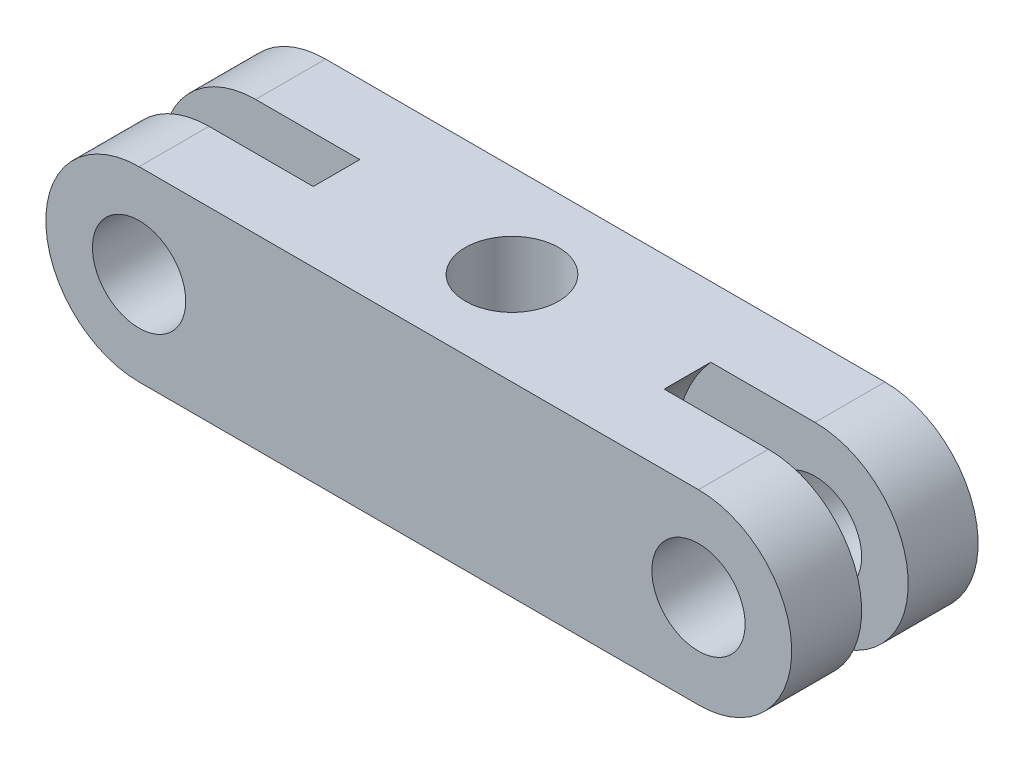
ISO-10303-21;
HEADER;
FILE_DESCRIPTION(('STEP AP214'),'2;1');
FILE_NAME('part.step','',(''),(''),'','','');
FILE_SCHEMA(('AUTOMOTIVE_DESIGN { 1 0 10303 214 1 1 1 1 }'));
ENDSEC;
DATA;
#1=APPLICATION_CONTEXT('core data for automotive mechanical design processes');
#2=APPLICATION_PROTOCOL_DEFINITION('international standard','automotive_design',2000,#1);
#3=PRODUCT_CONTEXT('',#1,'mechanical');
#4=PRODUCT('Part','Part','',(#3));
#5=PRODUCT_RELATED_PRODUCT_CATEGORY('part','',(#4));
#6=PRODUCT_DEFINITION_FORMATION('','',#4);
#7=PRODUCT_DEFINITION_CONTEXT('part definition',#1,'design');
#8=PRODUCT_DEFINITION('design','',#6,#7);
#9=PRODUCT_DEFINITION_SHAPE('','',#8);
#10=(LENGTH_UNIT() NAMED_UNIT(*) SI_UNIT(.MILLI.,.METRE.));
#11=(NAMED_UNIT(*) PLANE_ANGLE_UNIT() SI_UNIT($,.RADIAN.));
#12=(NAMED_UNIT(*) SI_UNIT($,.STERADIAN.) SOLID_ANGLE_UNIT());
#13=UNCERTAINTY_MEASURE_WITH_UNIT(LENGTH_MEASURE(1.E-05),#10,'distance_accuracy_value','');
#14=(GEOMETRIC_REPRESENTATION_CONTEXT(3) GLOBAL_UNCERTAINTY_ASSIGNED_CONTEXT((#13)) GLOBAL_UNIT_ASSIGNED_CONTEXT((#10,
#11,#12)) REPRESENTATION_CONTEXT('',''));
#15=CARTESIAN_POINT('',(0.,0.,0.));
#16=DIRECTION('',(0.,0.,1.));
#17=DIRECTION('',(1.,0.,0.));
#18=AXIS2_PLACEMENT_3D('',#15,#16,#17);
#19=CARTESIAN_POINT('',(0.,0.,10.));
#20=DIRECTION('',(0.,0.,-1.));
#21=DIRECTION('',(-1.,0.,0.));
#22=AXIS2_PLACEMENT_3D('',#19,#20,#21);
#23=CYLINDRICAL_SURFACE('',#22,10.);
#24=CARTESIAN_POINT('',(0.,0.,-2.5));
#25=DIRECTION('',(0.,0.,1.));
#26=DIRECTION('',(1.,0.,0.));
#27=AXIS2_PLACEMENT_3D('',#24,#25,#26);
#28=CIRCLE('',#27,10.);
#29=CARTESIAN_POINT('',(0.,10.,-2.5));
#30=VERTEX_POINT('',#29);
#31=CARTESIAN_POINT('',(0.,-10.,-2.5));
#32=VERTEX_POINT('',#31);
#33=EDGE_CURVE('E160',#30,#32,#28,.T.);
#34=ORIENTED_EDGE('',*,*,#33,.F.);
#35=DIRECTION('',(0.,0.,-1.));
#36=VECTOR('',#35,1.);
#37=CARTESIAN_POINT('',(0.,10.,10.));
#38=LINE('',#37,#36);
#39=CARTESIAN_POINT('',(0.,10.,-10.));
#40=VERTEX_POINT('',#39);
#41=EDGE_CURVE('E181',#30,#40,#38,.T.);
#42=ORIENTED_EDGE('',*,*,#41,.T.);
#43=CARTESIAN_POINT('',(0.,0.,-10.));
#44=DIRECTION('',(0.,0.,1.));
#45=DIRECTION('',(1.,0.,0.));
#46=AXIS2_PLACEMENT_3D('',#43,#44,#45);
#47=CIRCLE('',#46,10.);
#48=CARTESIAN_POINT('',(0.,-10.,-10.));
#49=VERTEX_POINT('',#48);
#50=EDGE_CURVE('E168',#40,#49,#47,.T.);
#51=ORIENTED_EDGE('',*,*,#50,.T.);
#52=DIRECTION('',(0.,0.,-1.));
#53=VECTOR('',#52,1.);
#54=CARTESIAN_POINT('',(0.,-10.,10.));
#55=LINE('',#54,#53);
#56=EDGE_CURVE('E204',#32,#49,#55,.T.);
#57=ORIENTED_EDGE('',*,*,#56,.F.);
#58=EDGE_LOOP('',(#34,#42,#51,#57));
#59=FACE_BOUND('',#58,.T.);
#60=ADVANCED_FACE('F39',(#59),#23,.T.);
#61=CARTESIAN_POINT('',(0.,-10.,10.));
#62=DIRECTION('',(0.,1.,0.));
#63=DIRECTION('',(0.,0.,1.));
#64=AXIS2_PLACEMENT_3D('',#61,#62,#63);
#65=PLANE('',#64);
#66=CARTESIAN_POINT('',(30.,-10.,0.));
#67=DIRECTION('',(0.,1.,0.));
#68=DIRECTION('',(0.,0.,1.));
#69=AXIS2_PLACEMENT_3D('',#66,#67,#68);
#70=CIRCLE('',#69,5.);
#71=CARTESIAN_POINT('',(30.,-10.,5.));
#72=VERTEX_POINT('',#71);
#73=EDGE_CURVE('E263',#72,#72,#70,.T.);
#74=ORIENTED_EDGE('',*,*,#73,.T.);
#75=EDGE_LOOP('',(#74));
#76=FACE_BOUND('',#75,.T.);
#77=DIRECTION('',(1.,0.,0.));
#78=VECTOR('',#77,1.);
#79=CARTESIAN_POINT('',(0.,-10.,-2.5));
#80=LINE('',#79,#78);
#81=CARTESIAN_POINT('',(11.180339887499,-10.,-2.5));
#82=VERTEX_POINT('',#81);
#83=EDGE_CURVE('E155',#32,#82,#80,.T.);
#84=ORIENTED_EDGE('',*,*,#83,.F.);
#85=ORIENTED_EDGE('',*,*,#56,.T.);
#86=DIRECTION('',(1.,0.,0.));
#87=VECTOR('',#86,1.);
#88=CARTESIAN_POINT('',(0.,-10.,-10.));
#89=LINE('',#88,#87);
#90=CARTESIAN_POINT('',(60.,-10.,-10.));
#91=VERTEX_POINT('',#90);
#92=EDGE_CURVE('E189',#49,#91,#89,.T.);
#93=ORIENTED_EDGE('',*,*,#92,.T.);
#94=DIRECTION('',(0.,0.,-1.));
#95=VECTOR('',#94,1.);
#96=CARTESIAN_POINT('',(60.,-10.,10.));
#97=LINE('',#96,#95);
#98=CARTESIAN_POINT('',(60.,-10.,-2.5));
#99=VERTEX_POINT('',#98);
#100=EDGE_CURVE('E203',#99,#91,#97,.T.);
#101=ORIENTED_EDGE('',*,*,#100,.F.);
#102=DIRECTION('',(1.,0.,0.));
#103=VECTOR('',#102,1.);
#104=CARTESIAN_POINT('',(0.,-10.,-2.5));
#105=LINE('',#104,#103);
#106=CARTESIAN_POINT('',(48.8196601125011,-10.,-2.5));
#107=VERTEX_POINT('',#106);
#108=EDGE_CURVE('E147',#107,#99,#105,.T.);
#109=ORIENTED_EDGE('',*,*,#108,.F.);
#110=DIRECTION('',(0.,0.,1.));
#111=VECTOR('',#110,1.);
#112=CARTESIAN_POINT('',(48.8196601125011,-10.,-2.5));
#113=LINE('',#112,#111);
#114=CARTESIAN_POINT('',(48.8196601125011,-10.,2.5));
#115=VERTEX_POINT('',#114);
#116=EDGE_CURVE('E137',#107,#115,#113,.T.);
#117=ORIENTED_EDGE('',*,*,#116,.T.);
#118=DIRECTION('',(1.,0.,0.));
#119=VECTOR('',#118,1.);
#120=CARTESIAN_POINT('',(0.,-10.,2.5));
#121=LINE('',#120,#119);
#122=CARTESIAN_POINT('',(60.,-10.,2.5));
#123=VERTEX_POINT('',#122);
#124=EDGE_CURVE('E127',#115,#123,#121,.T.);
#125=ORIENTED_EDGE('',*,*,#124,.T.);
#126=CARTESIAN_POINT('',(60.,-10.,10.));
#127=VERTEX_POINT('',#126);
#128=EDGE_CURVE('E205',#127,#123,#97,.T.);
#129=ORIENTED_EDGE('',*,*,#128,.F.);
#130=DIRECTION('',(1.,0.,0.));
#131=VECTOR('',#130,1.);
#132=CARTESIAN_POINT('',(0.,-10.,10.));
#133=LINE('',#132,#131);
#134=CARTESIAN_POINT('',(0.,-10.,10.));
#135=VERTEX_POINT('',#134);
#136=EDGE_CURVE('E178',#135,#127,#133,.T.);
#137=ORIENTED_EDGE('',*,*,#136,.F.);
#138=CARTESIAN_POINT('',(0.,-10.,2.5));
#139=VERTEX_POINT('',#138);
#140=EDGE_CURVE('E202',#135,#139,#55,.T.);
#141=ORIENTED_EDGE('',*,*,#140,.T.);
#142=DIRECTION('',(1.,0.,0.));
#143=VECTOR('',#142,1.);
#144=CARTESIAN_POINT('',(0.,-10.,2.5));
#145=LINE('',#144,#143);
#146=CARTESIAN_POINT('',(11.180339887499,-10.,2.5));
#147=VERTEX_POINT('',#146);
#148=EDGE_CURVE('E224',#139,#147,#145,.T.);
#149=ORIENTED_EDGE('',*,*,#148,.T.);
#150=DIRECTION('',(0.,0.,1.));
#151=VECTOR('',#150,1.);
#152=CARTESIAN_POINT('',(11.180339887499,-10.,-2.5));
#153=LINE('',#152,#151);
#154=EDGE_CURVE('E151',#147,#82,#153,.F.);
#155=ORIENTED_EDGE('',*,*,#154,.T.);
#156=EDGE_LOOP('',(#84,#85,#93,#101,#109,#117,#125,#129,#137,#141,#149,#155));
#157=FACE_BOUND('',#156,.T.);
#158=ADVANCED_FACE('F146',(#76,#157),#65,.F.);
#159=CARTESIAN_POINT('',(60.,0.,10.));
#160=DIRECTION('',(0.,0.,-1.));
#161=DIRECTION('',(-1.,0.,0.));
#162=AXIS2_PLACEMENT_3D('',#159,#160,#161);
#163=CYLINDRICAL_SURFACE('',#162,10.);
#164=CARTESIAN_POINT('',(60.,0.,-2.5));
#165=DIRECTION('',(0.,0.,1.));
#166=DIRECTION('',(1.,0.,0.));
#167=AXIS2_PLACEMENT_3D('',#164,#165,#166);
#168=CIRCLE('',#167,10.);
#169=CARTESIAN_POINT('',(60.,10.,-2.5));
#170=VERTEX_POINT('',#169);
#171=EDGE_CURVE('E237',#99,#170,#168,.T.);
#172=ORIENTED_EDGE('',*,*,#171,.F.);
#173=ORIENTED_EDGE('',*,*,#100,.T.);
#174=CARTESIAN_POINT('',(60.,0.,-10.));
#175=DIRECTION('',(0.,0.,1.));
#176=DIRECTION('',(1.,0.,0.));
#177=AXIS2_PLACEMENT_3D('',#174,#175,#176);
#178=CIRCLE('',#177,10.);
#179=CARTESIAN_POINT('',(60.,10.,-10.));
#180=VERTEX_POINT('',#179);
#181=EDGE_CURVE('E188',#91,#180,#178,.T.);
#182=ORIENTED_EDGE('',*,*,#181,.T.);
#183=DIRECTION('',(0.,0.,-1.));
#184=VECTOR('',#183,1.);
#185=CARTESIAN_POINT('',(60.,10.,10.));
#186=LINE('',#185,#184);
#187=EDGE_CURVE('E197',#170,#180,#186,.T.);
#188=ORIENTED_EDGE('',*,*,#187,.F.);
#189=EDGE_LOOP('',(#172,#173,#182,#188));
#190=FACE_BOUND('',#189,.T.);
#191=ADVANCED_FACE('F257',(#190),#163,.T.);
#192=CARTESIAN_POINT('',(0.,10.,10.));
#193=DIRECTION('',(0.,-1.,0.));
#194=DIRECTION('',(0.,0.,-1.));
#195=AXIS2_PLACEMENT_3D('',#192,#193,#194);
#196=PLANE('',#195);
#197=CARTESIAN_POINT('',(30.,10.,0.));
#198=DIRECTION('',(0.,1.,0.));
#199=DIRECTION('',(0.,0.,1.));
#200=AXIS2_PLACEMENT_3D('',#197,#198,#199);
#201=CIRCLE('',#200,5.);
#202=CARTESIAN_POINT('',(30.,10.,5.));
#203=VERTEX_POINT('',#202);
#204=EDGE_CURVE('E264',#203,#203,#201,.T.);
#205=ORIENTED_EDGE('',*,*,#204,.F.);
#206=EDGE_LOOP('',(#205));
#207=FACE_BOUND('',#206,.T.);
#208=DIRECTION('',(-1.,0.,0.));
#209=VECTOR('',#208,1.);
#210=CARTESIAN_POINT('',(0.,10.,-2.5));
#211=LINE('',#210,#209);
#212=CARTESIAN_POINT('',(11.180339887499,10.,-2.5));
#213=VERTEX_POINT('',#212);
#214=EDGE_CURVE('E225',#213,#30,#211,.T.);
#215=ORIENTED_EDGE('',*,*,#214,.F.);
#216=DIRECTION('',(0.,0.,1.));
#217=VECTOR('',#216,1.);
#218=CARTESIAN_POINT('',(11.180339887499,10.,-2.5));
#219=LINE('',#218,#217);
#220=CARTESIAN_POINT('',(11.180339887499,10.,2.5));
#221=VERTEX_POINT('',#220);
#222=EDGE_CURVE('E11',#213,#221,#219,.T.);
#223=ORIENTED_EDGE('',*,*,#222,.T.);
#224=DIRECTION('',(-1.,0.,0.));
#225=VECTOR('',#224,1.);
#226=CARTESIAN_POINT('',(0.,10.,2.5));
#227=LINE('',#226,#225);
#228=CARTESIAN_POINT('',(0.,10.,2.5));
#229=VERTEX_POINT('',#228);
#230=EDGE_CURVE('E218',#221,#229,#227,.T.);
#231=ORIENTED_EDGE('',*,*,#230,.T.);
#232=CARTESIAN_POINT('',(0.,10.,10.));
#233=VERTEX_POINT('',#232);
#234=EDGE_CURVE('E192',#233,#229,#38,.T.);
#235=ORIENTED_EDGE('',*,*,#234,.F.);
#236=DIRECTION('',(-1.,0.,0.));
#237=VECTOR('',#236,1.);
#238=CARTESIAN_POINT('',(0.,10.,10.));
#239=LINE('',#238,#237);
#240=CARTESIAN_POINT('',(60.,10.,10.));
#241=VERTEX_POINT('',#240);
#242=EDGE_CURVE('E182',#241,#233,#239,.T.);
#243=ORIENTED_EDGE('',*,*,#242,.F.);
#244=CARTESIAN_POINT('',(60.,10.,2.5));
#245=VERTEX_POINT('',#244);
#246=EDGE_CURVE('E196',#241,#245,#186,.T.);
#247=ORIENTED_EDGE('',*,*,#246,.T.);
#248=DIRECTION('',(-1.,0.,0.));
#249=VECTOR('',#248,1.);
#250=CARTESIAN_POINT('',(0.,10.,2.5));
#251=LINE('',#250,#249);
#252=CARTESIAN_POINT('',(48.8196601125011,10.,2.5));
#253=VERTEX_POINT('',#252);
#254=EDGE_CURVE('E211',#245,#253,#251,.T.);
#255=ORIENTED_EDGE('',*,*,#254,.T.);
#256=DIRECTION('',(0.,0.,1.));
#257=VECTOR('',#256,1.);
#258=CARTESIAN_POINT('',(48.8196601125011,10.,-2.5));
#259=LINE('',#258,#257);
#260=CARTESIAN_POINT('',(48.8196601125011,10.,-2.5));
#261=VERTEX_POINT('',#260);
#262=EDGE_CURVE('E50',#253,#261,#259,.F.);
#263=ORIENTED_EDGE('',*,*,#262,.T.);
#264=DIRECTION('',(-1.,0.,0.));
#265=VECTOR('',#264,1.);
#266=CARTESIAN_POINT('',(0.,10.,-2.5));
#267=LINE('',#266,#265);
#268=EDGE_CURVE('E214',#170,#261,#267,.T.);
#269=ORIENTED_EDGE('',*,*,#268,.F.);
#270=ORIENTED_EDGE('',*,*,#187,.T.);
#271=DIRECTION('',(-1.,0.,0.));
#272=VECTOR('',#271,1.);
#273=CARTESIAN_POINT('',(0.,10.,-10.));
#274=LINE('',#273,#272);
#275=EDGE_CURVE('E180',#180,#40,#274,.T.);
#276=ORIENTED_EDGE('',*,*,#275,.T.);
#277=ORIENTED_EDGE('',*,*,#41,.F.);
#278=EDGE_LOOP('',(#215,#223,#231,#235,#243,#247,#255,#263,#269,#270,#276,#277));
#279=FACE_BOUND('',#278,.T.);
#280=ADVANCED_FACE('F226',(#207,#279),#196,.F.);
#281=CARTESIAN_POINT('',(0.,0.,10.));
#282=DIRECTION('',(0.,0.,-1.));
#283=DIRECTION('',(-1.,0.,0.));
#284=AXIS2_PLACEMENT_3D('',#281,#282,#283);
#285=CYLINDRICAL_SURFACE('',#284,5.);
#286=CARTESIAN_POINT('',(0.,0.,-10.));
#287=DIRECTION('',(0.,0.,1.));
#288=DIRECTION('',(1.,0.,0.));
#289=AXIS2_PLACEMENT_3D('',#286,#287,#288);
#290=CIRCLE('',#289,5.);
#291=CARTESIAN_POINT('',(5.,0.,-10.));
#292=VERTEX_POINT('',#291);
#293=EDGE_CURVE('E163',#292,#292,#290,.T.);
#294=ORIENTED_EDGE('',*,*,#293,.F.);
#295=EDGE_LOOP('',(#294));
#296=FACE_BOUND('',#295,.T.);
#297=CARTESIAN_POINT('',(0.,0.,-2.5));
#298=DIRECTION('',(0.,0.,1.));
#299=DIRECTION('',(1.,0.,0.));
#300=AXIS2_PLACEMENT_3D('',#297,#298,#299);
#301=CIRCLE('',#300,5.);
#302=CARTESIAN_POINT('',(5.,0.,-2.5));
#303=VERTEX_POINT('',#302);
#304=EDGE_CURVE('E219',#303,#303,#301,.T.);
#305=ORIENTED_EDGE('',*,*,#304,.T.);
#306=EDGE_LOOP('',(#305));
#307=FACE_BOUND('',#306,.T.);
#308=ADVANCED_FACE('F322',(#296,#307),#285,.F.);
#309=CARTESIAN_POINT('',(60.,0.,10.));
#310=DIRECTION('',(0.,0.,-1.));
#311=DIRECTION('',(-1.,0.,0.));
#312=AXIS2_PLACEMENT_3D('',#309,#310,#311);
#313=CYLINDRICAL_SURFACE('',#312,5.);
#314=CARTESIAN_POINT('',(60.,0.,-10.));
#315=DIRECTION('',(0.,0.,1.));
#316=DIRECTION('',(1.,0.,0.));
#317=AXIS2_PLACEMENT_3D('',#314,#315,#316);
#318=CIRCLE('',#317,5.);
#319=CARTESIAN_POINT('',(65.,0.,-10.));
#320=VERTEX_POINT('',#319);
#321=EDGE_CURVE('E154',#320,#320,#318,.T.);
#322=ORIENTED_EDGE('',*,*,#321,.F.);
#323=EDGE_LOOP('',(#322));
#324=FACE_BOUND('',#323,.T.);
#325=CARTESIAN_POINT('',(60.,0.,-2.5));
#326=DIRECTION('',(0.,0.,1.));
#327=DIRECTION('',(1.,0.,0.));
#328=AXIS2_PLACEMENT_3D('',#325,#326,#327);
#329=CIRCLE('',#328,5.);
#330=CARTESIAN_POINT('',(65.,0.,-2.5));
#331=VERTEX_POINT('',#330);
#332=EDGE_CURVE('E133',#331,#331,#329,.T.);
#333=ORIENTED_EDGE('',*,*,#332,.T.);
#334=EDGE_LOOP('',(#333));
#335=FACE_BOUND('',#334,.T.);
#336=ADVANCED_FACE('F318',(#324,#335),#313,.F.);
#337=CARTESIAN_POINT('',(0.,0.,10.));
#338=DIRECTION('',(0.,0.,1.));
#339=DIRECTION('',(1.,0.,0.));
#340=AXIS2_PLACEMENT_3D('',#337,#338,#339);
#341=PLANE('',#340);
#342=CARTESIAN_POINT('',(0.,0.,10.));
#343=DIRECTION('',(0.,0.,1.));
#344=DIRECTION('',(1.,0.,0.));
#345=AXIS2_PLACEMENT_3D('',#342,#343,#344);
#346=CIRCLE('',#345,5.);
#347=CARTESIAN_POINT('',(5.,0.,10.));
#348=VERTEX_POINT('',#347);
#349=EDGE_CURVE('E170',#348,#348,#346,.T.);
#350=ORIENTED_EDGE('',*,*,#349,.F.);
#351=EDGE_LOOP('',(#350));
#352=FACE_BOUND('',#351,.T.);
#353=CARTESIAN_POINT('',(0.,0.,10.));
#354=DIRECTION('',(0.,0.,1.));
#355=DIRECTION('',(1.,0.,0.));
#356=AXIS2_PLACEMENT_3D('',#353,#354,#355);
#357=CIRCLE('',#356,10.);
#358=EDGE_CURVE('E175',#233,#135,#357,.T.);
#359=ORIENTED_EDGE('',*,*,#358,.T.);
#360=ORIENTED_EDGE('',*,*,#136,.T.);
#361=CARTESIAN_POINT('',(60.,0.,10.));
#362=DIRECTION('',(0.,0.,1.));
#363=DIRECTION('',(1.,0.,0.));
#364=AXIS2_PLACEMENT_3D('',#361,#362,#363);
#365=CIRCLE('',#364,10.);
#366=EDGE_CURVE('E177',#127,#241,#365,.T.);
#367=ORIENTED_EDGE('',*,*,#366,.T.);
#368=ORIENTED_EDGE('',*,*,#242,.T.);
#369=EDGE_LOOP('',(#359,#360,#367,#368));
#370=FACE_BOUND('',#369,.T.);
#371=CARTESIAN_POINT('',(60.,0.,10.));
#372=DIRECTION('',(0.,0.,1.));
#373=DIRECTION('',(1.,0.,0.));
#374=AXIS2_PLACEMENT_3D('',#371,#372,#373);
#375=CIRCLE('',#374,5.);
#376=CARTESIAN_POINT('',(65.,0.,10.));
#377=VERTEX_POINT('',#376);
#378=EDGE_CURVE('E161',#377,#377,#375,.T.);
#379=ORIENTED_EDGE('',*,*,#378,.F.);
#380=EDGE_LOOP('',(#379));
#381=FACE_BOUND('',#380,.T.);
#382=ADVANCED_FACE('F281',(#352,#370,#381),#341,.T.);
#383=CARTESIAN_POINT('',(0.,0.,-10.));
#384=DIRECTION('',(0.,0.,1.));
#385=DIRECTION('',(1.,0.,0.));
#386=AXIS2_PLACEMENT_3D('',#383,#384,#385);
#387=PLANE('',#386);
#388=ORIENTED_EDGE('',*,*,#50,.F.);
#389=ORIENTED_EDGE('',*,*,#275,.F.);
#390=ORIENTED_EDGE('',*,*,#181,.F.);
#391=ORIENTED_EDGE('',*,*,#92,.F.);
#392=EDGE_LOOP('',(#388,#389,#390,#391));
#393=FACE_BOUND('',#392,.T.);
#394=ORIENTED_EDGE('',*,*,#293,.T.);
#395=EDGE_LOOP('',(#394));
#396=FACE_BOUND('',#395,.T.);
#397=ORIENTED_EDGE('',*,*,#321,.T.);
#398=EDGE_LOOP('',(#397));
#399=FACE_BOUND('',#398,.T.);
#400=ADVANCED_FACE('F254',(#393,#396,#399),#387,.F.);
#401=ORIENTED_EDGE('',*,*,#234,.T.);
#402=CARTESIAN_POINT('',(0.,0.,2.5));
#403=DIRECTION('',(0.,0.,1.));
#404=DIRECTION('',(1.,0.,0.));
#405=AXIS2_PLACEMENT_3D('',#402,#403,#404);
#406=CIRCLE('',#405,10.);
#407=EDGE_CURVE('E61',#229,#139,#406,.T.);
#408=ORIENTED_EDGE('',*,*,#407,.T.);
#409=ORIENTED_EDGE('',*,*,#140,.F.);
#410=ORIENTED_EDGE('',*,*,#358,.F.);
#411=EDGE_LOOP('',(#401,#408,#409,#410));
#412=FACE_BOUND('',#411,.T.);
#413=ADVANCED_FACE('F41',(#412),#23,.T.);
#414=ORIENTED_EDGE('',*,*,#128,.T.);
#415=CARTESIAN_POINT('',(60.,0.,2.5));
#416=DIRECTION('',(0.,0.,1.));
#417=DIRECTION('',(1.,0.,0.));
#418=AXIS2_PLACEMENT_3D('',#415,#416,#417);
#419=CIRCLE('',#418,10.);
#420=EDGE_CURVE('E129',#123,#245,#419,.T.);
#421=ORIENTED_EDGE('',*,*,#420,.T.);
#422=ORIENTED_EDGE('',*,*,#246,.F.);
#423=ORIENTED_EDGE('',*,*,#366,.F.);
#424=EDGE_LOOP('',(#414,#421,#422,#423));
#425=FACE_BOUND('',#424,.T.);
#426=ADVANCED_FACE('F288',(#425),#163,.T.);
#427=CARTESIAN_POINT('',(0.,0.,2.5));
#428=DIRECTION('',(0.,0.,1.));
#429=DIRECTION('',(1.,0.,0.));
#430=AXIS2_PLACEMENT_3D('',#427,#428,#429);
#431=CIRCLE('',#430,5.);
#432=CARTESIAN_POINT('',(5.,0.,2.5));
#433=VERTEX_POINT('',#432);
#434=EDGE_CURVE('E216',#433,#433,#431,.T.);
#435=ORIENTED_EDGE('',*,*,#434,.F.);
#436=EDGE_LOOP('',(#435));
#437=FACE_BOUND('',#436,.T.);
#438=ORIENTED_EDGE('',*,*,#349,.T.);
#439=EDGE_LOOP('',(#438));
#440=FACE_BOUND('',#439,.T.);
#441=ADVANCED_FACE('F315',(#437,#440),#285,.F.);
#442=CARTESIAN_POINT('',(60.,0.,2.5));
#443=DIRECTION('',(0.,0.,1.));
#444=DIRECTION('',(1.,0.,0.));
#445=AXIS2_PLACEMENT_3D('',#442,#443,#444);
#446=CIRCLE('',#445,5.);
#447=CARTESIAN_POINT('',(65.,0.,2.5));
#448=VERTEX_POINT('',#447);
#449=EDGE_CURVE('E208',#448,#448,#446,.T.);
#450=ORIENTED_EDGE('',*,*,#449,.F.);
#451=EDGE_LOOP('',(#450));
#452=FACE_BOUND('',#451,.T.);
#453=ORIENTED_EDGE('',*,*,#378,.T.);
#454=EDGE_LOOP('',(#453));
#455=FACE_BOUND('',#454,.T.);
#456=ADVANCED_FACE('F350',(#452,#455),#313,.F.);
#457=CARTESIAN_POINT('',(60.,0.,-2.5));
#458=DIRECTION('',(0.,0.,1.));
#459=DIRECTION('',(1.,0.,0.));
#460=AXIS2_PLACEMENT_3D('',#457,#458,#459);
#461=CYLINDRICAL_SURFACE('',#460,15.);
#462=CARTESIAN_POINT('',(60.,0.,-2.5));
#463=DIRECTION('',(0.,0.,1.));
#464=DIRECTION('',(1.,0.,0.));
#465=AXIS2_PLACEMENT_3D('',#462,#463,#464);
#466=CIRCLE('',#465,15.);
#467=EDGE_CURVE('E145',#261,#107,#466,.T.);
#468=ORIENTED_EDGE('',*,*,#467,.F.);
#469=ORIENTED_EDGE('',*,*,#262,.F.);
#470=CARTESIAN_POINT('',(60.,0.,2.5));
#471=DIRECTION('',(0.,0.,1.));
#472=DIRECTION('',(1.,0.,0.));
#473=AXIS2_PLACEMENT_3D('',#470,#471,#472);
#474=CIRCLE('',#473,15.);
#475=EDGE_CURVE('E53',#253,#115,#474,.T.);
#476=ORIENTED_EDGE('',*,*,#475,.T.);
#477=ORIENTED_EDGE('',*,*,#116,.F.);
#478=EDGE_LOOP('',(#468,#469,#476,#477));
#479=FACE_BOUND('',#478,.T.);
#480=ADVANCED_FACE('F136',(#479),#461,.F.);
#481=CARTESIAN_POINT('',(60.,0.,-2.5));
#482=DIRECTION('',(0.,0.,1.));
#483=DIRECTION('',(1.,0.,0.));
#484=AXIS2_PLACEMENT_3D('',#481,#482,#483);
#485=PLANE('',#484);
#486=ORIENTED_EDGE('',*,*,#332,.F.);
#487=EDGE_LOOP('',(#486));
#488=FACE_BOUND('',#487,.T.);
#489=ORIENTED_EDGE('',*,*,#108,.T.);
#490=ORIENTED_EDGE('',*,*,#171,.T.);
#491=ORIENTED_EDGE('',*,*,#268,.T.);
#492=ORIENTED_EDGE('',*,*,#467,.T.);
#493=EDGE_LOOP('',(#489,#490,#491,#492));
#494=FACE_BOUND('',#493,.T.);
#495=ADVANCED_FACE('F265',(#488,#494),#485,.T.);
#496=CARTESIAN_POINT('',(60.,0.,2.5));
#497=DIRECTION('',(0.,0.,1.));
#498=DIRECTION('',(1.,0.,0.));
#499=AXIS2_PLACEMENT_3D('',#496,#497,#498);
#500=PLANE('',#499);
#501=ORIENTED_EDGE('',*,*,#449,.T.);
#502=EDGE_LOOP('',(#501));
#503=FACE_BOUND('',#502,.T.);
#504=ORIENTED_EDGE('',*,*,#475,.F.);
#505=ORIENTED_EDGE('',*,*,#254,.F.);
#506=ORIENTED_EDGE('',*,*,#420,.F.);
#507=ORIENTED_EDGE('',*,*,#124,.F.);
#508=EDGE_LOOP('',(#504,#505,#506,#507));
#509=FACE_BOUND('',#508,.T.);
#510=ADVANCED_FACE('F130',(#503,#509),#500,.F.);
#511=CARTESIAN_POINT('',(0.,0.,-2.5));
#512=DIRECTION('',(0.,0.,1.));
#513=DIRECTION('',(1.,0.,0.));
#514=AXIS2_PLACEMENT_3D('',#511,#512,#513);
#515=CYLINDRICAL_SURFACE('',#514,15.);
#516=CARTESIAN_POINT('',(0.,0.,2.5));
#517=DIRECTION('',(0.,0.,1.));
#518=DIRECTION('',(1.,0.,0.));
#519=AXIS2_PLACEMENT_3D('',#516,#517,#518);
#520=CIRCLE('',#519,15.);
#521=EDGE_CURVE('E141',#147,#221,#520,.T.);
#522=ORIENTED_EDGE('',*,*,#521,.T.);
#523=ORIENTED_EDGE('',*,*,#222,.F.);
#524=CARTESIAN_POINT('',(0.,0.,-2.5));
#525=DIRECTION('',(0.,0.,1.));
#526=DIRECTION('',(1.,0.,0.));
#527=AXIS2_PLACEMENT_3D('',#524,#525,#526);
#528=CIRCLE('',#527,15.);
#529=EDGE_CURVE('E215',#82,#213,#528,.T.);
#530=ORIENTED_EDGE('',*,*,#529,.F.);
#531=ORIENTED_EDGE('',*,*,#154,.F.);
#532=EDGE_LOOP('',(#522,#523,#530,#531));
#533=FACE_BOUND('',#532,.T.);
#534=ADVANCED_FACE('F277',(#533),#515,.F.);
#535=CARTESIAN_POINT('',(0.,0.,-2.5));
#536=DIRECTION('',(0.,0.,1.));
#537=DIRECTION('',(1.,0.,0.));
#538=AXIS2_PLACEMENT_3D('',#535,#536,#537);
#539=PLANE('',#538);
#540=ORIENTED_EDGE('',*,*,#304,.F.);
#541=EDGE_LOOP('',(#540));
#542=FACE_BOUND('',#541,.T.);
#543=ORIENTED_EDGE('',*,*,#83,.T.);
#544=ORIENTED_EDGE('',*,*,#529,.T.);
#545=ORIENTED_EDGE('',*,*,#214,.T.);
#546=ORIENTED_EDGE('',*,*,#33,.T.);
#547=EDGE_LOOP('',(#543,#544,#545,#546));
#548=FACE_BOUND('',#547,.T.);
#549=ADVANCED_FACE('F242',(#542,#548),#539,.T.);
#550=CARTESIAN_POINT('',(0.,0.,2.5));
#551=DIRECTION('',(0.,0.,1.));
#552=DIRECTION('',(1.,0.,0.));
#553=AXIS2_PLACEMENT_3D('',#550,#551,#552);
#554=PLANE('',#553);
#555=ORIENTED_EDGE('',*,*,#434,.T.);
#556=EDGE_LOOP('',(#555));
#557=FACE_BOUND('',#556,.T.);
#558=ORIENTED_EDGE('',*,*,#407,.F.);
#559=ORIENTED_EDGE('',*,*,#230,.F.);
#560=ORIENTED_EDGE('',*,*,#521,.F.);
#561=ORIENTED_EDGE('',*,*,#148,.F.);
#562=EDGE_LOOP('',(#558,#559,#560,#561));
#563=FACE_BOUND('',#562,.T.);
#564=ADVANCED_FACE('F290',(#557,#563),#554,.F.);
#565=CARTESIAN_POINT('',(30.,-10.,0.));
#566=DIRECTION('',(0.,1.,0.));
#567=DIRECTION('',(0.,0.,1.));
#568=AXIS2_PLACEMENT_3D('',#565,#566,#567);
#569=CYLINDRICAL_SURFACE('',#568,5.);
#570=ORIENTED_EDGE('',*,*,#73,.F.);
#571=EDGE_LOOP('',(#570));
#572=FACE_BOUND('',#571,.T.);
#573=ORIENTED_EDGE('',*,*,#204,.T.);
#574=EDGE_LOOP('',(#573));
#575=FACE_BOUND('',#574,.T.);
#576=ADVANCED_FACE('F287',(#572,#575),#569,.F.);
#577=CLOSED_SHELL('',(#60,#158,#191,#280,#308,#336,#382,#400,#413,#426,#441,#456,#480,#495,#510,
#534,#549,#564,#576));
#578=MANIFOLD_SOLID_BREP('B2',#577);
#579=ADVANCED_BREP_SHAPE_REPRESENTATION('',(#18,#578),#14);
#580=SHAPE_DEFINITION_REPRESENTATION(#9,#579);
ENDSEC;
END-ISO-10303-21;
